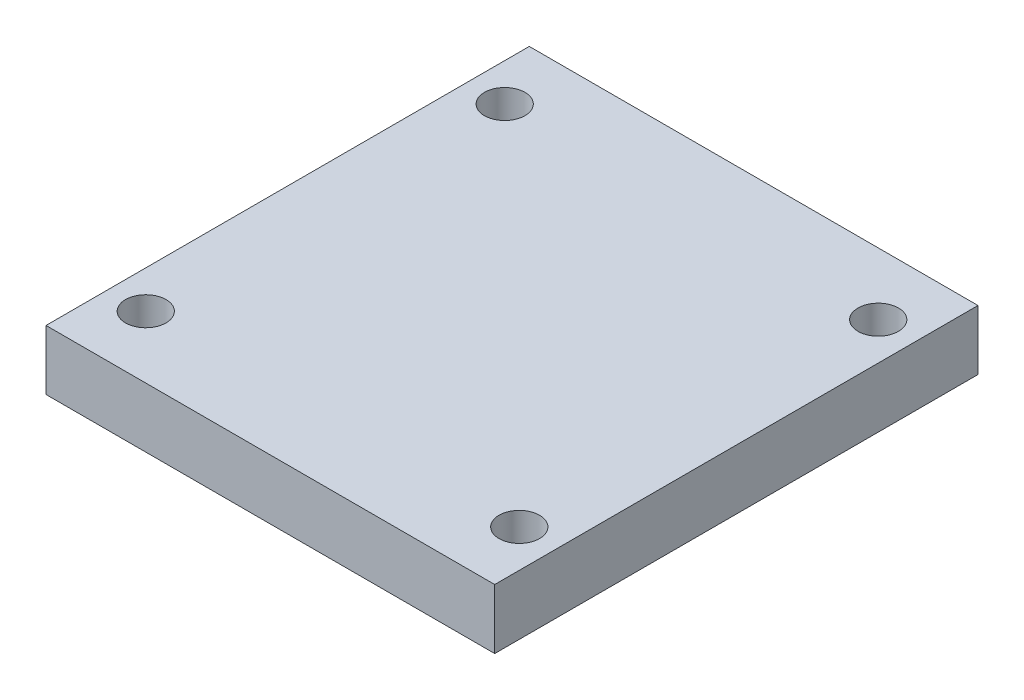
ISO-10303-21;
HEADER;
FILE_DESCRIPTION(('STEP AP214'),'2;1');
FILE_NAME('part.step','',(''),(''),'','','');
FILE_SCHEMA(('AUTOMOTIVE_DESIGN { 1 0 10303 214 1 1 1 1 }'));
ENDSEC;
DATA;
#1=APPLICATION_CONTEXT('core data for automotive mechanical design processes');
#2=APPLICATION_PROTOCOL_DEFINITION('international standard','automotive_design',2000,#1);
#3=PRODUCT_CONTEXT('',#1,'mechanical');
#4=PRODUCT('Part','Part','',(#3));
#5=PRODUCT_RELATED_PRODUCT_CATEGORY('part','',(#4));
#6=PRODUCT_DEFINITION_FORMATION('','',#4);
#7=PRODUCT_DEFINITION_CONTEXT('part definition',#1,'design');
#8=PRODUCT_DEFINITION('design','',#6,#7);
#9=PRODUCT_DEFINITION_SHAPE('','',#8);
#10=(LENGTH_UNIT() NAMED_UNIT(*) SI_UNIT(.MILLI.,.METRE.));
#11=(NAMED_UNIT(*) PLANE_ANGLE_UNIT() SI_UNIT($,.RADIAN.));
#12=(NAMED_UNIT(*) SI_UNIT($,.STERADIAN.) SOLID_ANGLE_UNIT());
#13=UNCERTAINTY_MEASURE_WITH_UNIT(LENGTH_MEASURE(1.E-05),#10,'distance_accuracy_value','');
#14=(GEOMETRIC_REPRESENTATION_CONTEXT(3) GLOBAL_UNCERTAINTY_ASSIGNED_CONTEXT((#13)) GLOBAL_UNIT_ASSIGNED_CONTEXT((#10,
#11,#12)) REPRESENTATION_CONTEXT('',''));
#15=CARTESIAN_POINT('',(0.,0.,0.));
#16=DIRECTION('',(0.,0.,1.));
#17=DIRECTION('',(1.,0.,0.));
#18=AXIS2_PLACEMENT_3D('',#15,#16,#17);
#19=CARTESIAN_POINT('',(0.,6.35,0.));
#20=DIRECTION('',(0.,1.,0.));
#21=DIRECTION('',(0.,0.,1.));
#22=AXIS2_PLACEMENT_3D('',#19,#20,#21);
#23=PLANE('',#22);
#24=CARTESIAN_POINT('',(-66.5475,6.35,6.78260869565217));
#25=DIRECTION('',(0.,1.,0.));
#26=DIRECTION('',(0.,0.,1.));
#27=AXIS2_PLACEMENT_3D('',#24,#25,#26);
#28=CIRCLE('',#27,2.15);
#29=CARTESIAN_POINT('',(-66.5475,6.35,8.93260869565217));
#30=VERTEX_POINT('',#29);
#31=EDGE_CURVE('E120',#30,#30,#28,.T.);
#32=ORIENTED_EDGE('',*,*,#31,.F.);
#33=EDGE_LOOP('',(#32));
#34=FACE_BOUND('',#33,.T.);
#35=CARTESIAN_POINT('',(-66.5475,6.35,-31.3173913043478));
#36=DIRECTION('',(0.,1.,0.));
#37=DIRECTION('',(0.,0.,1.));
#38=AXIS2_PLACEMENT_3D('',#35,#36,#37);
#39=CIRCLE('',#38,2.15);
#40=CARTESIAN_POINT('',(-66.5475,6.35,-29.1673913043478));
#41=VERTEX_POINT('',#40);
#42=EDGE_CURVE('E99',#41,#41,#39,.T.);
#43=ORIENTED_EDGE('',*,*,#42,.F.);
#44=EDGE_LOOP('',(#43));
#45=FACE_BOUND('',#44,.T.);
#46=DIRECTION('',(0.,0.,-1.));
#47=VECTOR('',#46,1.);
#48=CARTESIAN_POINT('',(-22.9075,6.35,-37.9173913043478));
#49=LINE('',#48,#47);
#50=CARTESIAN_POINT('',(-22.9075,6.35,13.3826086956522));
#51=VERTEX_POINT('',#50);
#52=CARTESIAN_POINT('',(-22.9075,6.35,-37.9173913043478));
#53=VERTEX_POINT('',#52);
#54=EDGE_CURVE('E84',#51,#53,#49,.T.);
#55=ORIENTED_EDGE('',*,*,#54,.T.);
#56=DIRECTION('',(-1.,0.,0.));
#57=VECTOR('',#56,1.);
#58=CARTESIAN_POINT('',(-70.5375,6.35,-37.9173913043478));
#59=LINE('',#58,#57);
#60=CARTESIAN_POINT('',(-70.5375,6.35,-37.9173913043478));
#61=VERTEX_POINT('',#60);
#62=EDGE_CURVE('E79',#53,#61,#59,.T.);
#63=ORIENTED_EDGE('',*,*,#62,.T.);
#64=DIRECTION('',(0.,0.,1.));
#65=VECTOR('',#64,1.);
#66=CARTESIAN_POINT('',(-70.5375,6.35,-37.9173913043478));
#67=LINE('',#66,#65);
#68=CARTESIAN_POINT('',(-70.5375,6.35,13.3826086956522));
#69=VERTEX_POINT('',#68);
#70=EDGE_CURVE('E82',#61,#69,#67,.T.);
#71=ORIENTED_EDGE('',*,*,#70,.T.);
#72=DIRECTION('',(1.,0.,0.));
#73=VECTOR('',#72,1.);
#74=CARTESIAN_POINT('',(-70.5375,6.35,13.3826086956522));
#75=LINE('',#74,#73);
#76=EDGE_CURVE('E49',#69,#51,#75,.T.);
#77=ORIENTED_EDGE('',*,*,#76,.T.);
#78=EDGE_LOOP('',(#55,#63,#71,#77));
#79=FACE_BOUND('',#78,.T.);
#80=CARTESIAN_POINT('',(-26.8975,6.35,-31.3173913043478));
#81=DIRECTION('',(0.,1.,0.));
#82=DIRECTION('',(0.,0.,1.));
#83=AXIS2_PLACEMENT_3D('',#80,#81,#82);
#84=CIRCLE('',#83,2.15);
#85=CARTESIAN_POINT('',(-26.8975,6.35,-29.1673913043478));
#86=VERTEX_POINT('',#85);
#87=EDGE_CURVE('E114',#86,#86,#84,.T.);
#88=ORIENTED_EDGE('',*,*,#87,.F.);
#89=EDGE_LOOP('',(#88));
#90=FACE_BOUND('',#89,.T.);
#91=CARTESIAN_POINT('',(-26.8975,6.35,6.78260869565217));
#92=DIRECTION('',(0.,1.,0.));
#93=DIRECTION('',(0.,0.,1.));
#94=AXIS2_PLACEMENT_3D('',#91,#92,#93);
#95=CIRCLE('',#94,2.15);
#96=CARTESIAN_POINT('',(-26.8975,6.35,8.93260869565217));
#97=VERTEX_POINT('',#96);
#98=EDGE_CURVE('E126',#97,#97,#95,.T.);
#99=ORIENTED_EDGE('',*,*,#98,.F.);
#100=EDGE_LOOP('',(#99));
#101=FACE_BOUND('',#100,.T.);
#102=ADVANCED_FACE('F32',(#34,#45,#79,#90,#101),#23,.T.);
#103=CARTESIAN_POINT('',(0.,0.,0.));
#104=DIRECTION('',(0.,1.,0.));
#105=DIRECTION('',(0.,0.,1.));
#106=AXIS2_PLACEMENT_3D('',#103,#104,#105);
#107=PLANE('',#106);
#108=DIRECTION('',(0.,0.,-1.));
#109=VECTOR('',#108,1.);
#110=CARTESIAN_POINT('',(-22.9075,0.,-37.9173913043478));
#111=LINE('',#110,#109);
#112=CARTESIAN_POINT('',(-22.9075,0.,13.3826086956522));
#113=VERTEX_POINT('',#112);
#114=CARTESIAN_POINT('',(-22.9075,0.,-37.9173913043478));
#115=VERTEX_POINT('',#114);
#116=EDGE_CURVE('E96',#113,#115,#111,.T.);
#117=ORIENTED_EDGE('',*,*,#116,.F.);
#118=DIRECTION('',(1.,0.,0.));
#119=VECTOR('',#118,1.);
#120=CARTESIAN_POINT('',(-70.5375,0.,13.3826086956522));
#121=LINE('',#120,#119);
#122=CARTESIAN_POINT('',(-70.5375,0.,13.3826086956522));
#123=VERTEX_POINT('',#122);
#124=EDGE_CURVE('E72',#123,#113,#121,.T.);
#125=ORIENTED_EDGE('',*,*,#124,.F.);
#126=DIRECTION('',(0.,0.,1.));
#127=VECTOR('',#126,1.);
#128=CARTESIAN_POINT('',(-70.5375,0.,-37.9173913043478));
#129=LINE('',#128,#127);
#130=CARTESIAN_POINT('',(-70.5375,0.,-37.9173913043478));
#131=VERTEX_POINT('',#130);
#132=EDGE_CURVE('E66',#131,#123,#129,.T.);
#133=ORIENTED_EDGE('',*,*,#132,.F.);
#134=DIRECTION('',(-1.,0.,0.));
#135=VECTOR('',#134,1.);
#136=CARTESIAN_POINT('',(-70.5375,0.,-37.9173913043478));
#137=LINE('',#136,#135);
#138=EDGE_CURVE('E88',#115,#131,#137,.T.);
#139=ORIENTED_EDGE('',*,*,#138,.F.);
#140=EDGE_LOOP('',(#117,#125,#133,#139));
#141=FACE_BOUND('',#140,.T.);
#142=CARTESIAN_POINT('',(-66.5475,0.,-31.3173913043478));
#143=DIRECTION('',(0.,1.,0.));
#144=DIRECTION('',(0.,0.,1.));
#145=AXIS2_PLACEMENT_3D('',#142,#143,#144);
#146=CIRCLE('',#145,2.15);
#147=CARTESIAN_POINT('',(-66.5475,0.,-29.1673913043478));
#148=VERTEX_POINT('',#147);
#149=EDGE_CURVE('E111',#148,#148,#146,.T.);
#150=ORIENTED_EDGE('',*,*,#149,.T.);
#151=EDGE_LOOP('',(#150));
#152=FACE_BOUND('',#151,.T.);
#153=CARTESIAN_POINT('',(-26.8975,0.,-31.3173913043478));
#154=DIRECTION('',(0.,1.,0.));
#155=DIRECTION('',(0.,0.,1.));
#156=AXIS2_PLACEMENT_3D('',#153,#154,#155);
#157=CIRCLE('',#156,2.15);
#158=CARTESIAN_POINT('',(-26.8975,0.,-29.1673913043478));
#159=VERTEX_POINT('',#158);
#160=EDGE_CURVE('E117',#159,#159,#157,.T.);
#161=ORIENTED_EDGE('',*,*,#160,.T.);
#162=EDGE_LOOP('',(#161));
#163=FACE_BOUND('',#162,.T.);
#164=CARTESIAN_POINT('',(-66.5475,0.,6.78260869565217));
#165=DIRECTION('',(0.,1.,0.));
#166=DIRECTION('',(0.,0.,1.));
#167=AXIS2_PLACEMENT_3D('',#164,#165,#166);
#168=CIRCLE('',#167,2.15);
#169=CARTESIAN_POINT('',(-66.5475,0.,8.93260869565217));
#170=VERTEX_POINT('',#169);
#171=EDGE_CURVE('E123',#170,#170,#168,.T.);
#172=ORIENTED_EDGE('',*,*,#171,.T.);
#173=EDGE_LOOP('',(#172));
#174=FACE_BOUND('',#173,.T.);
#175=CARTESIAN_POINT('',(-26.8975,0.,6.78260869565217));
#176=DIRECTION('',(0.,1.,0.));
#177=DIRECTION('',(0.,0.,1.));
#178=AXIS2_PLACEMENT_3D('',#175,#176,#177);
#179=CIRCLE('',#178,2.15);
#180=CARTESIAN_POINT('',(-26.8975,0.,8.93260869565217));
#181=VERTEX_POINT('',#180);
#182=EDGE_CURVE('E129',#181,#181,#179,.T.);
#183=ORIENTED_EDGE('',*,*,#182,.T.);
#184=EDGE_LOOP('',(#183));
#185=FACE_BOUND('',#184,.T.);
#186=ADVANCED_FACE('F107',(#141,#152,#163,#174,#185),#107,.F.);
#187=CARTESIAN_POINT('',(-22.9075,6.35,-37.9173913043478));
#188=DIRECTION('',(-1.,0.,0.));
#189=DIRECTION('',(0.,0.,1.));
#190=AXIS2_PLACEMENT_3D('',#187,#188,#189);
#191=PLANE('',#190);
#192=ORIENTED_EDGE('',*,*,#116,.T.);
#193=DIRECTION('',(0.,-1.,0.));
#194=VECTOR('',#193,1.);
#195=CARTESIAN_POINT('',(-22.9075,6.35,-37.9173913043478));
#196=LINE('',#195,#194);
#197=EDGE_CURVE('E11',#53,#115,#196,.T.);
#198=ORIENTED_EDGE('',*,*,#197,.F.);
#199=ORIENTED_EDGE('',*,*,#54,.F.);
#200=DIRECTION('',(0.,-1.,0.));
#201=VECTOR('',#200,1.);
#202=CARTESIAN_POINT('',(-22.9075,6.35,13.3826086956522));
#203=LINE('',#202,#201);
#204=EDGE_CURVE('E92',#51,#113,#203,.T.);
#205=ORIENTED_EDGE('',*,*,#204,.T.);
#206=EDGE_LOOP('',(#192,#198,#199,#205));
#207=FACE_BOUND('',#206,.T.);
#208=ADVANCED_FACE('F34',(#207),#191,.F.);
#209=CARTESIAN_POINT('',(-70.5375,6.35,-37.9173913043478));
#210=DIRECTION('',(0.,0.,1.));
#211=DIRECTION('',(1.,0.,0.));
#212=AXIS2_PLACEMENT_3D('',#209,#210,#211);
#213=PLANE('',#212);
#214=ORIENTED_EDGE('',*,*,#138,.T.);
#215=DIRECTION('',(0.,-1.,0.));
#216=VECTOR('',#215,1.);
#217=CARTESIAN_POINT('',(-70.5375,6.35,-37.9173913043478));
#218=LINE('',#217,#216);
#219=EDGE_CURVE('E41',#61,#131,#218,.T.);
#220=ORIENTED_EDGE('',*,*,#219,.F.);
#221=ORIENTED_EDGE('',*,*,#62,.F.);
#222=ORIENTED_EDGE('',*,*,#197,.T.);
#223=EDGE_LOOP('',(#214,#220,#221,#222));
#224=FACE_BOUND('',#223,.T.);
#225=ADVANCED_FACE('F87',(#224),#213,.F.);
#226=CARTESIAN_POINT('',(-70.5375,6.35,-37.9173913043478));
#227=DIRECTION('',(1.,0.,0.));
#228=DIRECTION('',(0.,0.,-1.));
#229=AXIS2_PLACEMENT_3D('',#226,#227,#228);
#230=PLANE('',#229);
#231=ORIENTED_EDGE('',*,*,#132,.T.);
#232=DIRECTION('',(0.,-1.,0.));
#233=VECTOR('',#232,1.);
#234=CARTESIAN_POINT('',(-70.5375,6.35,13.3826086956522));
#235=LINE('',#234,#233);
#236=EDGE_CURVE('E89',#69,#123,#235,.T.);
#237=ORIENTED_EDGE('',*,*,#236,.F.);
#238=ORIENTED_EDGE('',*,*,#70,.F.);
#239=ORIENTED_EDGE('',*,*,#219,.T.);
#240=EDGE_LOOP('',(#231,#237,#238,#239));
#241=FACE_BOUND('',#240,.T.);
#242=ADVANCED_FACE('F90',(#241),#230,.F.);
#243=CARTESIAN_POINT('',(-70.5375,6.35,13.3826086956522));
#244=DIRECTION('',(0.,0.,-1.));
#245=DIRECTION('',(-1.,0.,0.));
#246=AXIS2_PLACEMENT_3D('',#243,#244,#245);
#247=PLANE('',#246);
#248=ORIENTED_EDGE('',*,*,#124,.T.);
#249=ORIENTED_EDGE('',*,*,#204,.F.);
#250=ORIENTED_EDGE('',*,*,#76,.F.);
#251=ORIENTED_EDGE('',*,*,#236,.T.);
#252=EDGE_LOOP('',(#248,#249,#250,#251));
#253=FACE_BOUND('',#252,.T.);
#254=ADVANCED_FACE('F104',(#253),#247,.F.);
#255=CARTESIAN_POINT('',(-66.5475,6.35,-31.3173913043478));
#256=DIRECTION('',(0.,-1.,0.));
#257=DIRECTION('',(0.,0.,-1.));
#258=AXIS2_PLACEMENT_3D('',#255,#256,#257);
#259=CYLINDRICAL_SURFACE('',#258,2.15);
#260=ORIENTED_EDGE('',*,*,#42,.T.);
#261=EDGE_LOOP('',(#260));
#262=FACE_BOUND('',#261,.T.);
#263=ORIENTED_EDGE('',*,*,#149,.F.);
#264=EDGE_LOOP('',(#263));
#265=FACE_BOUND('',#264,.T.);
#266=ADVANCED_FACE('F148',(#262,#265),#259,.F.);
#267=CARTESIAN_POINT('',(-26.8975,6.35,-31.3173913043478));
#268=DIRECTION('',(0.,-1.,0.));
#269=DIRECTION('',(0.,0.,-1.));
#270=AXIS2_PLACEMENT_3D('',#267,#268,#269);
#271=CYLINDRICAL_SURFACE('',#270,2.15);
#272=ORIENTED_EDGE('',*,*,#87,.T.);
#273=EDGE_LOOP('',(#272));
#274=FACE_BOUND('',#273,.T.);
#275=ORIENTED_EDGE('',*,*,#160,.F.);
#276=EDGE_LOOP('',(#275));
#277=FACE_BOUND('',#276,.T.);
#278=ADVANCED_FACE('F194',(#274,#277),#271,.F.);
#279=CARTESIAN_POINT('',(-66.5475,6.35,6.78260869565217));
#280=DIRECTION('',(0.,-1.,0.));
#281=DIRECTION('',(0.,0.,-1.));
#282=AXIS2_PLACEMENT_3D('',#279,#280,#281);
#283=CYLINDRICAL_SURFACE('',#282,2.15);
#284=ORIENTED_EDGE('',*,*,#31,.T.);
#285=EDGE_LOOP('',(#284));
#286=FACE_BOUND('',#285,.T.);
#287=ORIENTED_EDGE('',*,*,#171,.F.);
#288=EDGE_LOOP('',(#287));
#289=FACE_BOUND('',#288,.T.);
#290=ADVANCED_FACE('F202',(#286,#289),#283,.F.);
#291=CARTESIAN_POINT('',(-26.8975,6.35,6.78260869565217));
#292=DIRECTION('',(0.,-1.,0.));
#293=DIRECTION('',(0.,0.,-1.));
#294=AXIS2_PLACEMENT_3D('',#291,#292,#293);
#295=CYLINDRICAL_SURFACE('',#294,2.15);
#296=ORIENTED_EDGE('',*,*,#98,.T.);
#297=EDGE_LOOP('',(#296));
#298=FACE_BOUND('',#297,.T.);
#299=ORIENTED_EDGE('',*,*,#182,.F.);
#300=EDGE_LOOP('',(#299));
#301=FACE_BOUND('',#300,.T.);
#302=ADVANCED_FACE('F135',(#298,#301),#295,.F.);
#303=CLOSED_SHELL('',(#102,#186,#208,#225,#242,#254,#266,#278,#290,#302));
#304=MANIFOLD_SOLID_BREP('B2',#303);
#305=ADVANCED_BREP_SHAPE_REPRESENTATION('',(#18,#304),#14);
#306=SHAPE_DEFINITION_REPRESENTATION(#9,#305);
ENDSEC;
END-ISO-10303-21;
